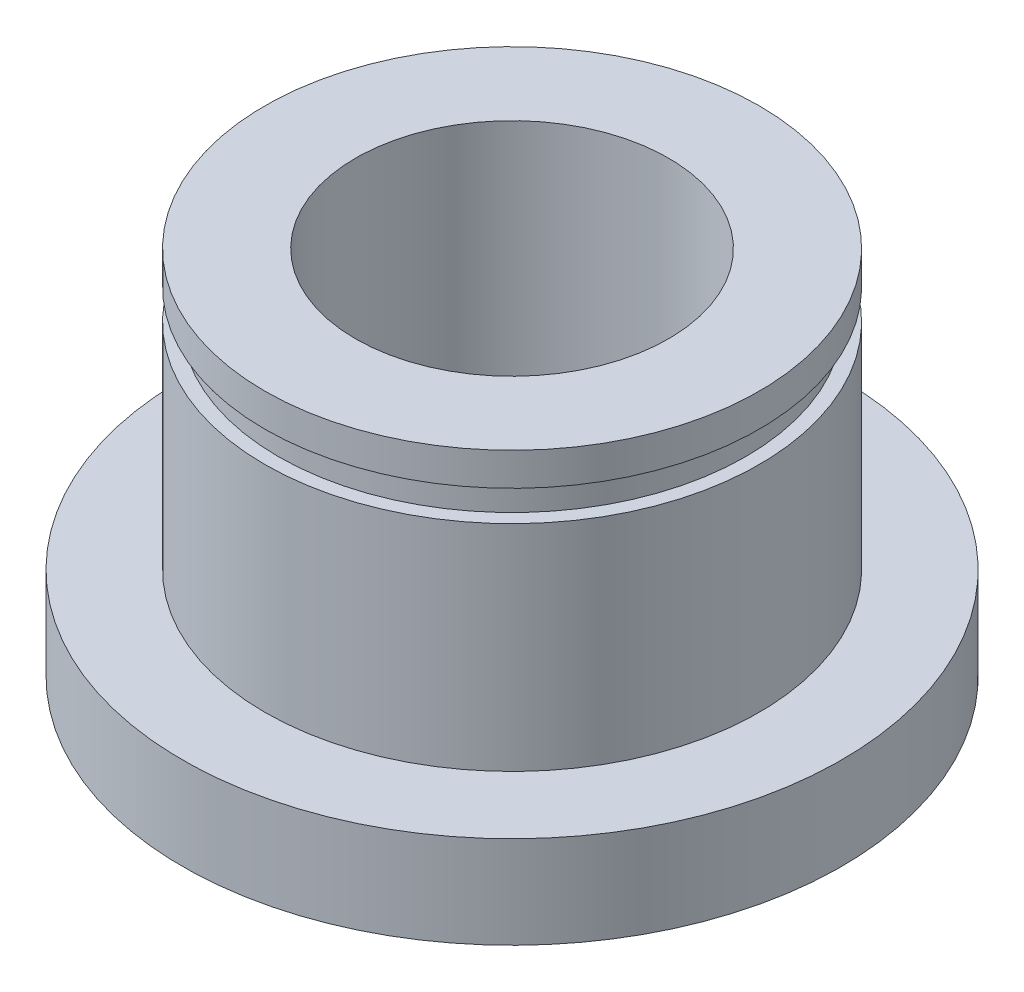
ISO-10303-21;
HEADER;
FILE_DESCRIPTION(('STEP AP214'),'2;1');
FILE_NAME('part.step','',(''),(''),'','','');
FILE_SCHEMA(('AUTOMOTIVE_DESIGN { 1 0 10303 214 1 1 1 1 }'));
ENDSEC;
DATA;
#1=APPLICATION_CONTEXT('core data for automotive mechanical design processes');
#2=APPLICATION_PROTOCOL_DEFINITION('international standard','automotive_design',2000,#1);
#3=PRODUCT_CONTEXT('',#1,'mechanical');
#4=PRODUCT('Part','Part','',(#3));
#5=PRODUCT_RELATED_PRODUCT_CATEGORY('part','',(#4));
#6=PRODUCT_DEFINITION_FORMATION('','',#4);
#7=PRODUCT_DEFINITION_CONTEXT('part definition',#1,'design');
#8=PRODUCT_DEFINITION('design','',#6,#7);
#9=PRODUCT_DEFINITION_SHAPE('','',#8);
#10=(LENGTH_UNIT() NAMED_UNIT(*) SI_UNIT(.MILLI.,.METRE.));
#11=(NAMED_UNIT(*) PLANE_ANGLE_UNIT() SI_UNIT($,.RADIAN.));
#12=(NAMED_UNIT(*) SI_UNIT($,.STERADIAN.) SOLID_ANGLE_UNIT());
#13=UNCERTAINTY_MEASURE_WITH_UNIT(LENGTH_MEASURE(1.E-05),#10,'distance_accuracy_value','');
#14=(GEOMETRIC_REPRESENTATION_CONTEXT(3) GLOBAL_UNCERTAINTY_ASSIGNED_CONTEXT((#13)) GLOBAL_UNIT_ASSIGNED_CONTEXT((#10,
#11,#12)) REPRESENTATION_CONTEXT('',''));
#15=CARTESIAN_POINT('',(0.,0.,0.));
#16=DIRECTION('',(0.,0.,1.));
#17=DIRECTION('',(1.,0.,0.));
#18=AXIS2_PLACEMENT_3D('',#15,#16,#17);
#19=CARTESIAN_POINT('',(0.,-4.460875,0.));
#20=DIRECTION('',(0.,1.,0.));
#21=DIRECTION('',(0.,0.,1.));
#22=AXIS2_PLACEMENT_3D('',#19,#20,#21);
#23=PLANE('',#22);
#24=CARTESIAN_POINT('',(0.,-4.460875,0.));
#25=DIRECTION('',(0.,1.,0.));
#26=DIRECTION('',(0.,0.,1.));
#27=AXIS2_PLACEMENT_3D('',#24,#25,#26);
#28=CIRCLE('',#27,4.564126);
#29=CARTESIAN_POINT('',(0.,-4.460875,4.564126));
#30=VERTEX_POINT('',#29);
#31=EDGE_CURVE('E49',#30,#30,#28,.T.);
#32=ORIENTED_EDGE('',*,*,#31,.T.);
#33=EDGE_LOOP('',(#32));
#34=FACE_BOUND('',#33,.T.);
#35=CARTESIAN_POINT('',(0.,-4.460875,0.));
#36=DIRECTION('',(0.,-1.,0.));
#37=DIRECTION('',(0.,0.,-1.));
#38=AXIS2_PLACEMENT_3D('',#35,#36,#37);
#39=CIRCLE('',#38,7.9375);
#40=CARTESIAN_POINT('',(0.,-4.460875,-7.9375));
#41=VERTEX_POINT('',#40);
#42=EDGE_CURVE('E55',#41,#41,#39,.T.);
#43=ORIENTED_EDGE('',*,*,#42,.T.);
#44=EDGE_LOOP('',(#43));
#45=FACE_BOUND('',#44,.T.);
#46=ADVANCED_FACE('F41',(#34,#45),#23,.F.);
#47=CARTESIAN_POINT('',(0.,0.,0.));
#48=DIRECTION('',(0.,-1.,0.));
#49=DIRECTION('',(0.,0.,-1.));
#50=AXIS2_PLACEMENT_3D('',#47,#48,#49);
#51=CYLINDRICAL_SURFACE('',#50,7.9375);
#52=ORIENTED_EDGE('',*,*,#42,.F.);
#53=EDGE_LOOP('',(#52));
#54=FACE_BOUND('',#53,.T.);
#55=CARTESIAN_POINT('',(0.,-2.238375,0.));
#56=DIRECTION('',(0.,-1.,0.));
#57=DIRECTION('',(0.,0.,-1.));
#58=AXIS2_PLACEMENT_3D('',#55,#56,#57);
#59=CIRCLE('',#58,7.9375);
#60=CARTESIAN_POINT('',(0.,-2.238375,-7.9375));
#61=VERTEX_POINT('',#60);
#62=EDGE_CURVE('E61',#61,#61,#59,.T.);
#63=ORIENTED_EDGE('',*,*,#62,.T.);
#64=EDGE_LOOP('',(#63));
#65=FACE_BOUND('',#64,.T.);
#66=ADVANCED_FACE('F118',(#54,#65),#51,.T.);
#67=CARTESIAN_POINT('',(0.,-2.238375,7.9375));
#68=DIRECTION('',(0.,-1.,0.));
#69=DIRECTION('',(0.,0.,-1.));
#70=AXIS2_PLACEMENT_3D('',#67,#68,#69);
#71=PLANE('',#70);
#72=ORIENTED_EDGE('',*,*,#62,.F.);
#73=EDGE_LOOP('',(#72));
#74=FACE_BOUND('',#73,.T.);
#75=CARTESIAN_POINT('',(0.,-2.238375,0.));
#76=DIRECTION('',(0.,-1.,0.));
#77=DIRECTION('',(0.,0.,-1.));
#78=AXIS2_PLACEMENT_3D('',#75,#76,#77);
#79=CIRCLE('',#78,5.953125);
#80=CARTESIAN_POINT('',(0.,-2.238375,-5.953125));
#81=VERTEX_POINT('',#80);
#82=EDGE_CURVE('E67',#81,#81,#79,.T.);
#83=ORIENTED_EDGE('',*,*,#82,.T.);
#84=EDGE_LOOP('',(#83));
#85=FACE_BOUND('',#84,.T.);
#86=ADVANCED_FACE('F122',(#74,#85),#71,.F.);
#87=CARTESIAN_POINT('',(0.,0.,0.));
#88=DIRECTION('',(0.,-1.,0.));
#89=DIRECTION('',(0.,0.,-1.));
#90=AXIS2_PLACEMENT_3D('',#87,#88,#89);
#91=CYLINDRICAL_SURFACE('',#90,5.953125);
#92=ORIENTED_EDGE('',*,*,#82,.F.);
#93=EDGE_LOOP('',(#92));
#94=FACE_BOUND('',#93,.T.);
#95=CARTESIAN_POINT('',(0.,2.930525,0.));
#96=DIRECTION('',(0.,-1.,0.));
#97=DIRECTION('',(0.,0.,-1.));
#98=AXIS2_PLACEMENT_3D('',#95,#96,#97);
#99=CIRCLE('',#98,5.953125);
#100=CARTESIAN_POINT('',(0.,2.930525,-5.953125));
#101=VERTEX_POINT('',#100);
#102=EDGE_CURVE('E71',#101,#101,#99,.T.);
#103=ORIENTED_EDGE('',*,*,#102,.T.);
#104=EDGE_LOOP('',(#103));
#105=FACE_BOUND('',#104,.T.);
#106=ADVANCED_FACE('F129',(#94,#105),#91,.T.);
#107=CARTESIAN_POINT('',(0.,2.930525,5.953125));
#108=DIRECTION('',(0.,-1.,0.));
#109=DIRECTION('',(0.,0.,-1.));
#110=AXIS2_PLACEMENT_3D('',#107,#108,#109);
#111=PLANE('',#110);
#112=ORIENTED_EDGE('',*,*,#102,.F.);
#113=EDGE_LOOP('',(#112));
#114=FACE_BOUND('',#113,.T.);
#115=CARTESIAN_POINT('',(0.,2.930525,0.));
#116=DIRECTION('',(0.,-1.,0.));
#117=DIRECTION('',(0.,0.,-1.));
#118=AXIS2_PLACEMENT_3D('',#115,#116,#117);
#119=CIRCLE('',#118,5.6261);
#120=CARTESIAN_POINT('',(0.,2.930525,-5.6261));
#121=VERTEX_POINT('',#120);
#122=EDGE_CURVE('E75',#121,#121,#119,.T.);
#123=ORIENTED_EDGE('',*,*,#122,.T.);
#124=EDGE_LOOP('',(#123));
#125=FACE_BOUND('',#124,.T.);
#126=ADVANCED_FACE('F133',(#114,#125),#111,.F.);
#127=CARTESIAN_POINT('',(0.,0.,0.));
#128=DIRECTION('',(0.,-1.,0.));
#129=DIRECTION('',(0.,0.,-1.));
#130=AXIS2_PLACEMENT_3D('',#127,#128,#129);
#131=CYLINDRICAL_SURFACE('',#130,5.6261);
#132=ORIENTED_EDGE('',*,*,#122,.F.);
#133=EDGE_LOOP('',(#132));
#134=FACE_BOUND('',#133,.T.);
#135=CARTESIAN_POINT('',(0.,3.667125,0.));
#136=DIRECTION('',(0.,-1.,0.));
#137=DIRECTION('',(0.,0.,-1.));
#138=AXIS2_PLACEMENT_3D('',#135,#136,#137);
#139=CIRCLE('',#138,5.6261);
#140=CARTESIAN_POINT('',(0.,3.667125,-5.6261));
#141=VERTEX_POINT('',#140);
#142=EDGE_CURVE('E79',#141,#141,#139,.T.);
#143=ORIENTED_EDGE('',*,*,#142,.T.);
#144=EDGE_LOOP('',(#143));
#145=FACE_BOUND('',#144,.T.);
#146=ADVANCED_FACE('F113',(#134,#145),#131,.T.);
#147=CARTESIAN_POINT('',(0.,3.667125,5.6261));
#148=DIRECTION('',(0.,1.,0.));
#149=DIRECTION('',(0.,0.,1.));
#150=AXIS2_PLACEMENT_3D('',#147,#148,#149);
#151=PLANE('',#150);
#152=ORIENTED_EDGE('',*,*,#142,.F.);
#153=EDGE_LOOP('',(#152));
#154=FACE_BOUND('',#153,.T.);
#155=CARTESIAN_POINT('',(0.,3.667125,0.));
#156=DIRECTION('',(0.,-1.,0.));
#157=DIRECTION('',(0.,0.,-1.));
#158=AXIS2_PLACEMENT_3D('',#155,#156,#157);
#159=CIRCLE('',#158,5.953125);
#160=CARTESIAN_POINT('',(0.,3.667125,-5.953125));
#161=VERTEX_POINT('',#160);
#162=EDGE_CURVE('E83',#161,#161,#159,.T.);
#163=ORIENTED_EDGE('',*,*,#162,.T.);
#164=EDGE_LOOP('',(#163));
#165=FACE_BOUND('',#164,.T.);
#166=ADVANCED_FACE('F107',(#154,#165),#151,.F.);
#167=CARTESIAN_POINT('',(0.,0.,0.));
#168=DIRECTION('',(0.,-1.,0.));
#169=DIRECTION('',(0.,0.,-1.));
#170=AXIS2_PLACEMENT_3D('',#167,#168,#169);
#171=CYLINDRICAL_SURFACE('',#170,5.953125);
#172=ORIENTED_EDGE('',*,*,#162,.F.);
#173=EDGE_LOOP('',(#172));
#174=FACE_BOUND('',#173,.T.);
#175=CARTESIAN_POINT('',(0.,4.460875,0.));
#176=DIRECTION('',(0.,-1.,0.));
#177=DIRECTION('',(0.,0.,-1.));
#178=AXIS2_PLACEMENT_3D('',#175,#176,#177);
#179=CIRCLE('',#178,5.953125);
#180=CARTESIAN_POINT('',(0.,4.460875,-5.953125));
#181=VERTEX_POINT('',#180);
#182=EDGE_CURVE('E87',#181,#181,#179,.T.);
#183=ORIENTED_EDGE('',*,*,#182,.T.);
#184=EDGE_LOOP('',(#183));
#185=FACE_BOUND('',#184,.T.);
#186=ADVANCED_FACE('F102',(#174,#185),#171,.T.);
#187=CARTESIAN_POINT('',(0.,4.460875,5.953125));
#188=DIRECTION('',(0.,-1.,0.));
#189=DIRECTION('',(0.,0.,-1.));
#190=AXIS2_PLACEMENT_3D('',#187,#188,#189);
#191=PLANE('',#190);
#192=CARTESIAN_POINT('',(0.,4.460875,0.));
#193=DIRECTION('',(0.,1.,0.));
#194=DIRECTION('',(0.,0.,1.));
#195=AXIS2_PLACEMENT_3D('',#192,#193,#194);
#196=CIRCLE('',#195,3.77037599999999);
#197=CARTESIAN_POINT('',(0.,4.460875,3.77037599999999));
#198=VERTEX_POINT('',#197);
#199=EDGE_CURVE('E91',#198,#198,#196,.T.);
#200=ORIENTED_EDGE('',*,*,#199,.F.);
#201=EDGE_LOOP('',(#200));
#202=FACE_BOUND('',#201,.T.);
#203=ORIENTED_EDGE('',*,*,#182,.F.);
#204=EDGE_LOOP('',(#203));
#205=FACE_BOUND('',#204,.T.);
#206=ADVANCED_FACE('F99',(#202,#205),#191,.F.);
#207=CARTESIAN_POINT('',(0.,4.460875,0.));
#208=DIRECTION('',(0.,1.,0.));
#209=DIRECTION('',(0.,0.,1.));
#210=AXIS2_PLACEMENT_3D('',#207,#208,#209);
#211=CYLINDRICAL_SURFACE('',#210,3.77037599999999);
#212=CARTESIAN_POINT('',(0.,-3.66712499999999,0.));
#213=DIRECTION('',(0.,1.,0.));
#214=DIRECTION('',(0.,0.,1.));
#215=AXIS2_PLACEMENT_3D('',#212,#213,#214);
#216=CIRCLE('',#215,3.77037599999999);
#217=CARTESIAN_POINT('',(0.,-3.66712499999999,3.77037599999999));
#218=VERTEX_POINT('',#217);
#219=EDGE_CURVE('E10',#218,#218,#216,.F.);
#220=ORIENTED_EDGE('',*,*,#219,.T.);
#221=EDGE_LOOP('',(#220));
#222=FACE_BOUND('',#221,.T.);
#223=ORIENTED_EDGE('',*,*,#199,.T.);
#224=EDGE_LOOP('',(#223));
#225=FACE_BOUND('',#224,.T.);
#226=ADVANCED_FACE('F97',(#222,#225),#211,.F.);
#227=CARTESIAN_POINT('',(0.,-4.460875,0.));
#228=DIRECTION('',(0.,-1.,0.));
#229=DIRECTION('',(0.,0.,-1.));
#230=AXIS2_PLACEMENT_3D('',#227,#228,#229);
#231=CONICAL_SURFACE('',#230,4.564126,0.785398163397447);
#232=ORIENTED_EDGE('',*,*,#219,.F.);
#233=EDGE_LOOP('',(#232));
#234=FACE_BOUND('',#233,.T.);
#235=ORIENTED_EDGE('',*,*,#31,.F.);
#236=EDGE_LOOP('',(#235));
#237=FACE_BOUND('',#236,.T.);
#238=ADVANCED_FACE('F43',(#234,#237),#231,.F.);
#239=CLOSED_SHELL('',(#46,#66,#86,#106,#126,#146,#166,#186,#206,#226,#238));
#240=MANIFOLD_SOLID_BREP('B2',#239);
#241=ADVANCED_BREP_SHAPE_REPRESENTATION('',(#18,#240),#14);
#242=SHAPE_DEFINITION_REPRESENTATION(#9,#241);
ENDSEC;
END-ISO-10303-21;
